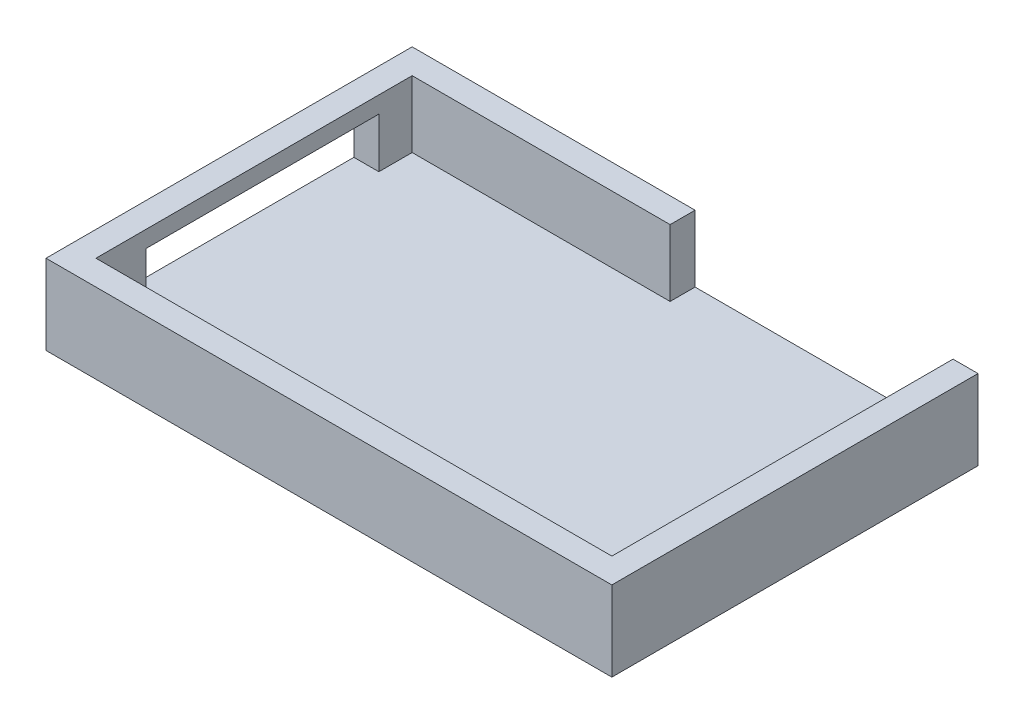
ISO-10303-21;
HEADER;
FILE_DESCRIPTION(('STEP AP214'),'2;1');
FILE_NAME('part.step','',(''),(''),'','','');
FILE_SCHEMA(('AUTOMOTIVE_DESIGN { 1 0 10303 214 1 1 1 1 }'));
ENDSEC;
DATA;
#1=APPLICATION_CONTEXT('core data for automotive mechanical design processes');
#2=APPLICATION_PROTOCOL_DEFINITION('international standard','automotive_design',2000,#1);
#3=PRODUCT_CONTEXT('',#1,'mechanical');
#4=PRODUCT('Part','Part','',(#3));
#5=PRODUCT_RELATED_PRODUCT_CATEGORY('part','',(#4));
#6=PRODUCT_DEFINITION_FORMATION('','',#4);
#7=PRODUCT_DEFINITION_CONTEXT('part definition',#1,'design');
#8=PRODUCT_DEFINITION('design','',#6,#7);
#9=PRODUCT_DEFINITION_SHAPE('','',#8);
#10=(LENGTH_UNIT() NAMED_UNIT(*) SI_UNIT(.MILLI.,.METRE.));
#11=(NAMED_UNIT(*) PLANE_ANGLE_UNIT() SI_UNIT($,.RADIAN.));
#12=(NAMED_UNIT(*) SI_UNIT($,.STERADIAN.) SOLID_ANGLE_UNIT());
#13=UNCERTAINTY_MEASURE_WITH_UNIT(LENGTH_MEASURE(1.E-05),#10,'distance_accuracy_value','');
#14=(GEOMETRIC_REPRESENTATION_CONTEXT(3) GLOBAL_UNCERTAINTY_ASSIGNED_CONTEXT((#13)) GLOBAL_UNIT_ASSIGNED_CONTEXT((#10,
#11,#12)) REPRESENTATION_CONTEXT('',''));
#15=CARTESIAN_POINT('',(0.,0.,0.));
#16=DIRECTION('',(0.,0.,1.));
#17=DIRECTION('',(1.,0.,0.));
#18=AXIS2_PLACEMENT_3D('',#15,#16,#17);
#19=CARTESIAN_POINT('',(85.,4.,55.));
#20=DIRECTION('',(-1.,0.,0.));
#21=DIRECTION('',(0.,0.,1.));
#22=AXIS2_PLACEMENT_3D('',#19,#20,#21);
#23=PLANE('',#22);
#24=DIRECTION('',(0.,0.,-1.));
#25=VECTOR('',#24,1.);
#26=CARTESIAN_POINT('',(85.,0.,55.));
#27=LINE('',#26,#25);
#28=CARTESIAN_POINT('',(85.,0.,55.));
#29=VERTEX_POINT('',#28);
#30=CARTESIAN_POINT('',(85.,0.,-55.));
#31=VERTEX_POINT('',#30);
#32=EDGE_CURVE('E192',#29,#31,#27,.T.);
#33=ORIENTED_EDGE('',*,*,#32,.T.);
#34=DIRECTION('',(0.,-1.,0.));
#35=VECTOR('',#34,1.);
#36=CARTESIAN_POINT('',(85.,4.,-55.));
#37=LINE('',#36,#35);
#38=CARTESIAN_POINT('',(85.,24.,-55.));
#39=VERTEX_POINT('',#38);
#40=EDGE_CURVE('E11',#39,#31,#37,.T.);
#41=ORIENTED_EDGE('',*,*,#40,.F.);
#42=DIRECTION('',(0.,0.,-1.));
#43=VECTOR('',#42,1.);
#44=CARTESIAN_POINT('',(85.,24.,55.));
#45=LINE('',#44,#43);
#46=CARTESIAN_POINT('',(85.,24.,55.));
#47=VERTEX_POINT('',#46);
#48=EDGE_CURVE('E186',#47,#39,#45,.T.);
#49=ORIENTED_EDGE('',*,*,#48,.F.);
#50=DIRECTION('',(0.,-1.,0.));
#51=VECTOR('',#50,1.);
#52=CARTESIAN_POINT('',(85.,4.,55.));
#53=LINE('',#52,#51);
#54=EDGE_CURVE('E201',#47,#29,#53,.T.);
#55=ORIENTED_EDGE('',*,*,#54,.T.);
#56=EDGE_LOOP('',(#33,#41,#49,#55));
#57=FACE_BOUND('',#56,.T.);
#58=ADVANCED_FACE('F36',(#57),#23,.F.);
#59=CARTESIAN_POINT('',(-85.,4.,-55.));
#60=DIRECTION('',(0.,0.,1.));
#61=DIRECTION('',(1.,0.,0.));
#62=AXIS2_PLACEMENT_3D('',#59,#60,#61);
#63=PLANE('',#62);
#64=DIRECTION('',(1.,0.,0.));
#65=VECTOR('',#64,1.);
#66=CARTESIAN_POINT('',(-85.,4.,-55.));
#67=LINE('',#66,#65);
#68=CARTESIAN_POINT('',(0.,4.,-55.));
#69=VERTEX_POINT('',#68);
#70=CARTESIAN_POINT('',(77.5,4.,-55.));
#71=VERTEX_POINT('',#70);
#72=EDGE_CURVE('E229',#69,#71,#67,.T.);
#73=ORIENTED_EDGE('',*,*,#72,.T.);
#74=DIRECTION('',(0.,1.,0.));
#75=VECTOR('',#74,1.);
#76=CARTESIAN_POINT('',(77.5,4.,-55.));
#77=LINE('',#76,#75);
#78=CARTESIAN_POINT('',(77.5,24.,-55.));
#79=VERTEX_POINT('',#78);
#80=EDGE_CURVE('E228',#71,#79,#77,.T.);
#81=ORIENTED_EDGE('',*,*,#80,.T.);
#82=DIRECTION('',(-1.,0.,0.));
#83=VECTOR('',#82,1.);
#84=CARTESIAN_POINT('',(85.,24.,-55.));
#85=LINE('',#84,#83);
#86=EDGE_CURVE('E190',#39,#79,#85,.T.);
#87=ORIENTED_EDGE('',*,*,#86,.F.);
#88=ORIENTED_EDGE('',*,*,#40,.T.);
#89=DIRECTION('',(-1.,0.,0.));
#90=VECTOR('',#89,1.);
#91=CARTESIAN_POINT('',(-85.,0.,-55.));
#92=LINE('',#91,#90);
#93=CARTESIAN_POINT('',(-85.,0.,-55.));
#94=VERTEX_POINT('',#93);
#95=EDGE_CURVE('E195',#31,#94,#92,.T.);
#96=ORIENTED_EDGE('',*,*,#95,.T.);
#97=DIRECTION('',(0.,-1.,0.));
#98=VECTOR('',#97,1.);
#99=CARTESIAN_POINT('',(-85.,4.,-55.));
#100=LINE('',#99,#98);
#101=CARTESIAN_POINT('',(-85.,24.,-55.));
#102=VERTEX_POINT('',#101);
#103=EDGE_CURVE('E43',#102,#94,#100,.T.);
#104=ORIENTED_EDGE('',*,*,#103,.F.);
#105=CARTESIAN_POINT('',(0.,24.,-55.));
#106=VERTEX_POINT('',#105);
#107=EDGE_CURVE('E189',#106,#102,#85,.T.);
#108=ORIENTED_EDGE('',*,*,#107,.F.);
#109=DIRECTION('',(0.,-1.,0.));
#110=VECTOR('',#109,1.);
#111=CARTESIAN_POINT('',(0.,4.,-55.));
#112=LINE('',#111,#110);
#113=EDGE_CURVE('E138',#106,#69,#112,.T.);
#114=ORIENTED_EDGE('',*,*,#113,.T.);
#115=EDGE_LOOP('',(#73,#81,#87,#88,#96,#104,#108,#114));
#116=FACE_BOUND('',#115,.T.);
#117=ADVANCED_FACE('F226',(#116),#63,.F.);
#118=CARTESIAN_POINT('',(-85.,4.,55.));
#119=DIRECTION('',(1.,0.,0.));
#120=DIRECTION('',(0.,0.,-1.));
#121=AXIS2_PLACEMENT_3D('',#118,#119,#120);
#122=PLANE('',#121);
#123=DIRECTION('',(0.,-1.,0.));
#124=VECTOR('',#123,1.);
#125=CARTESIAN_POINT('',(-85.,4.,32.5));
#126=LINE('',#125,#124);
#127=CARTESIAN_POINT('',(-85.,19.,32.5));
#128=VERTEX_POINT('',#127);
#129=CARTESIAN_POINT('',(-85.,4.,32.5));
#130=VERTEX_POINT('',#129);
#131=EDGE_CURVE('E257',#128,#130,#126,.T.);
#132=ORIENTED_EDGE('',*,*,#131,.T.);
#133=DIRECTION('',(0.,0.,-1.));
#134=VECTOR('',#133,1.);
#135=CARTESIAN_POINT('',(-85.,4.,55.));
#136=LINE('',#135,#134);
#137=CARTESIAN_POINT('',(-85.,4.,-37.5));
#138=VERTEX_POINT('',#137);
#139=EDGE_CURVE('E260',#130,#138,#136,.T.);
#140=ORIENTED_EDGE('',*,*,#139,.T.);
#141=DIRECTION('',(0.,1.,0.));
#142=VECTOR('',#141,1.);
#143=CARTESIAN_POINT('',(-85.,4.,-37.5));
#144=LINE('',#143,#142);
#145=CARTESIAN_POINT('',(-85.,19.,-37.5));
#146=VERTEX_POINT('',#145);
#147=EDGE_CURVE('E247',#138,#146,#144,.T.);
#148=ORIENTED_EDGE('',*,*,#147,.T.);
#149=DIRECTION('',(0.,0.,1.));
#150=VECTOR('',#149,1.);
#151=CARTESIAN_POINT('',(-85.,19.,55.));
#152=LINE('',#151,#150);
#153=EDGE_CURVE('E254',#146,#128,#152,.T.);
#154=ORIENTED_EDGE('',*,*,#153,.T.);
#155=EDGE_LOOP('',(#132,#140,#148,#154));
#156=FACE_BOUND('',#155,.T.);
#157=DIRECTION('',(0.,0.,1.));
#158=VECTOR('',#157,1.);
#159=CARTESIAN_POINT('',(-85.,0.,55.));
#160=LINE('',#159,#158);
#161=CARTESIAN_POINT('',(-85.,0.,55.));
#162=VERTEX_POINT('',#161);
#163=EDGE_CURVE('E197',#94,#162,#160,.T.);
#164=ORIENTED_EDGE('',*,*,#163,.T.);
#165=DIRECTION('',(0.,-1.,0.));
#166=VECTOR('',#165,1.);
#167=CARTESIAN_POINT('',(-85.,4.,55.));
#168=LINE('',#167,#166);
#169=CARTESIAN_POINT('',(-85.,24.,55.));
#170=VERTEX_POINT('',#169);
#171=EDGE_CURVE('E204',#170,#162,#168,.T.);
#172=ORIENTED_EDGE('',*,*,#171,.F.);
#173=DIRECTION('',(0.,0.,1.));
#174=VECTOR('',#173,1.);
#175=CARTESIAN_POINT('',(-85.,24.,55.));
#176=LINE('',#175,#174);
#177=EDGE_CURVE('E180',#102,#170,#176,.T.);
#178=ORIENTED_EDGE('',*,*,#177,.F.);
#179=ORIENTED_EDGE('',*,*,#103,.T.);
#180=EDGE_LOOP('',(#164,#172,#178,#179));
#181=FACE_BOUND('',#180,.T.);
#182=ADVANCED_FACE('F211',(#156,#181),#122,.F.);
#183=CARTESIAN_POINT('',(-85.,4.,55.));
#184=DIRECTION('',(0.,0.,-1.));
#185=DIRECTION('',(-1.,0.,0.));
#186=AXIS2_PLACEMENT_3D('',#183,#184,#185);
#187=PLANE('',#186);
#188=DIRECTION('',(1.,0.,0.));
#189=VECTOR('',#188,1.);
#190=CARTESIAN_POINT('',(-85.,0.,55.));
#191=LINE('',#190,#189);
#192=EDGE_CURVE('E199',#162,#29,#191,.T.);
#193=ORIENTED_EDGE('',*,*,#192,.T.);
#194=ORIENTED_EDGE('',*,*,#54,.F.);
#195=DIRECTION('',(1.,0.,0.));
#196=VECTOR('',#195,1.);
#197=CARTESIAN_POINT('',(85.,24.,55.));
#198=LINE('',#197,#196);
#199=EDGE_CURVE('E183',#170,#47,#198,.T.);
#200=ORIENTED_EDGE('',*,*,#199,.F.);
#201=ORIENTED_EDGE('',*,*,#171,.T.);
#202=EDGE_LOOP('',(#193,#194,#200,#201));
#203=FACE_BOUND('',#202,.T.);
#204=ADVANCED_FACE('F218',(#203),#187,.F.);
#205=CARTESIAN_POINT('',(0.,0.,0.));
#206=DIRECTION('',(0.,-1.,0.));
#207=DIRECTION('',(0.,0.,-1.));
#208=AXIS2_PLACEMENT_3D('',#205,#206,#207);
#209=PLANE('',#208);
#210=ORIENTED_EDGE('',*,*,#32,.F.);
#211=ORIENTED_EDGE('',*,*,#192,.F.);
#212=ORIENTED_EDGE('',*,*,#163,.F.);
#213=ORIENTED_EDGE('',*,*,#95,.F.);
#214=EDGE_LOOP('',(#210,#211,#212,#213));
#215=FACE_BOUND('',#214,.T.);
#216=ADVANCED_FACE('F216',(#215),#209,.T.);
#217=CARTESIAN_POINT('',(0.,24.,0.));
#218=DIRECTION('',(0.,1.,0.));
#219=DIRECTION('',(0.,0.,1.));
#220=AXIS2_PLACEMENT_3D('',#217,#218,#219);
#221=PLANE('',#220);
#222=ORIENTED_EDGE('',*,*,#86,.T.);
#223=DIRECTION('',(0.,0.,-1.));
#224=VECTOR('',#223,1.);
#225=CARTESIAN_POINT('',(77.5,24.,47.5));
#226=LINE('',#225,#224);
#227=CARTESIAN_POINT('',(77.5,24.,47.5));
#228=VERTEX_POINT('',#227);
#229=EDGE_CURVE('E158',#228,#79,#226,.T.);
#230=ORIENTED_EDGE('',*,*,#229,.F.);
#231=DIRECTION('',(1.,0.,0.));
#232=VECTOR('',#231,1.);
#233=CARTESIAN_POINT('',(77.5,24.,47.5));
#234=LINE('',#233,#232);
#235=CARTESIAN_POINT('',(-77.5,24.,47.5));
#236=VERTEX_POINT('',#235);
#237=EDGE_CURVE('E162',#236,#228,#234,.T.);
#238=ORIENTED_EDGE('',*,*,#237,.F.);
#239=DIRECTION('',(0.,0.,1.));
#240=VECTOR('',#239,1.);
#241=CARTESIAN_POINT('',(-77.5,24.,47.5));
#242=LINE('',#241,#240);
#243=CARTESIAN_POINT('',(-77.5,24.,-47.5));
#244=VERTEX_POINT('',#243);
#245=EDGE_CURVE('E156',#244,#236,#242,.T.);
#246=ORIENTED_EDGE('',*,*,#245,.F.);
#247=DIRECTION('',(-1.,0.,0.));
#248=VECTOR('',#247,1.);
#249=CARTESIAN_POINT('',(77.5,24.,-47.5));
#250=LINE('',#249,#248);
#251=CARTESIAN_POINT('',(0.,24.,-47.5));
#252=VERTEX_POINT('',#251);
#253=EDGE_CURVE('E148',#252,#244,#250,.T.);
#254=ORIENTED_EDGE('',*,*,#253,.F.);
#255=DIRECTION('',(0.,0.,1.));
#256=VECTOR('',#255,1.);
#257=CARTESIAN_POINT('',(0.,24.,-67.5));
#258=LINE('',#257,#256);
#259=EDGE_CURVE('E135',#106,#252,#258,.T.);
#260=ORIENTED_EDGE('',*,*,#259,.F.);
#261=ORIENTED_EDGE('',*,*,#107,.T.);
#262=ORIENTED_EDGE('',*,*,#177,.T.);
#263=ORIENTED_EDGE('',*,*,#199,.T.);
#264=ORIENTED_EDGE('',*,*,#48,.T.);
#265=EDGE_LOOP('',(#222,#230,#238,#246,#254,#260,#261,#262,#263,#264));
#266=FACE_BOUND('',#265,.T.);
#267=ADVANCED_FACE('F154',(#266),#221,.T.);
#268=CARTESIAN_POINT('',(-77.5,24.,47.5));
#269=DIRECTION('',(1.,0.,0.));
#270=DIRECTION('',(0.,0.,-1.));
#271=AXIS2_PLACEMENT_3D('',#268,#269,#270);
#272=PLANE('',#271);
#273=DIRECTION('',(0.,-1.,0.));
#274=VECTOR('',#273,1.);
#275=CARTESIAN_POINT('',(-77.5,4.,32.5));
#276=LINE('',#275,#274);
#277=CARTESIAN_POINT('',(-77.5,19.,32.5));
#278=VERTEX_POINT('',#277);
#279=CARTESIAN_POINT('',(-77.5,4.,32.5));
#280=VERTEX_POINT('',#279);
#281=EDGE_CURVE('E241',#278,#280,#276,.T.);
#282=ORIENTED_EDGE('',*,*,#281,.F.);
#283=DIRECTION('',(0.,0.,1.));
#284=VECTOR('',#283,1.);
#285=CARTESIAN_POINT('',(-77.5,19.,32.5));
#286=LINE('',#285,#284);
#287=CARTESIAN_POINT('',(-77.5,19.,-37.5));
#288=VERTEX_POINT('',#287);
#289=EDGE_CURVE('E234',#288,#278,#286,.T.);
#290=ORIENTED_EDGE('',*,*,#289,.F.);
#291=DIRECTION('',(0.,1.,0.));
#292=VECTOR('',#291,1.);
#293=CARTESIAN_POINT('',(-77.5,4.,-37.5));
#294=LINE('',#293,#292);
#295=CARTESIAN_POINT('',(-77.5,4.,-37.5));
#296=VERTEX_POINT('',#295);
#297=EDGE_CURVE('E232',#296,#288,#294,.T.);
#298=ORIENTED_EDGE('',*,*,#297,.F.);
#299=DIRECTION('',(0.,0.,1.));
#300=VECTOR('',#299,1.);
#301=CARTESIAN_POINT('',(-77.5,4.,47.5));
#302=LINE('',#301,#300);
#303=CARTESIAN_POINT('',(-77.5,4.,-47.5));
#304=VERTEX_POINT('',#303);
#305=EDGE_CURVE('E166',#304,#296,#302,.T.);
#306=ORIENTED_EDGE('',*,*,#305,.F.);
#307=DIRECTION('',(0.,-1.,0.));
#308=VECTOR('',#307,1.);
#309=CARTESIAN_POINT('',(-77.5,24.,-47.5));
#310=LINE('',#309,#308);
#311=EDGE_CURVE('E157',#244,#304,#310,.T.);
#312=ORIENTED_EDGE('',*,*,#311,.F.);
#313=ORIENTED_EDGE('',*,*,#245,.T.);
#314=DIRECTION('',(0.,-1.,0.));
#315=VECTOR('',#314,1.);
#316=CARTESIAN_POINT('',(-77.5,24.,47.5));
#317=LINE('',#316,#315);
#318=CARTESIAN_POINT('',(-77.5,4.,47.5));
#319=VERTEX_POINT('',#318);
#320=EDGE_CURVE('E177',#236,#319,#317,.T.);
#321=ORIENTED_EDGE('',*,*,#320,.T.);
#322=EDGE_CURVE('E170',#280,#319,#302,.T.);
#323=ORIENTED_EDGE('',*,*,#322,.F.);
#324=EDGE_LOOP('',(#282,#290,#298,#306,#312,#313,#321,#323));
#325=FACE_BOUND('',#324,.T.);
#326=ADVANCED_FACE('F274',(#325),#272,.T.);
#327=CARTESIAN_POINT('',(77.5,24.,47.5));
#328=DIRECTION('',(0.,0.,-1.));
#329=DIRECTION('',(-1.,0.,0.));
#330=AXIS2_PLACEMENT_3D('',#327,#328,#329);
#331=PLANE('',#330);
#332=DIRECTION('',(1.,0.,0.));
#333=VECTOR('',#332,1.);
#334=CARTESIAN_POINT('',(77.5,4.,47.5));
#335=LINE('',#334,#333);
#336=CARTESIAN_POINT('',(77.5,4.,47.5));
#337=VERTEX_POINT('',#336);
#338=EDGE_CURVE('E169',#319,#337,#335,.T.);
#339=ORIENTED_EDGE('',*,*,#338,.F.);
#340=ORIENTED_EDGE('',*,*,#320,.F.);
#341=ORIENTED_EDGE('',*,*,#237,.T.);
#342=DIRECTION('',(0.,-1.,0.));
#343=VECTOR('',#342,1.);
#344=CARTESIAN_POINT('',(77.5,24.,47.5));
#345=LINE('',#344,#343);
#346=EDGE_CURVE('E160',#228,#337,#345,.T.);
#347=ORIENTED_EDGE('',*,*,#346,.T.);
#348=EDGE_LOOP('',(#339,#340,#341,#347));
#349=FACE_BOUND('',#348,.T.);
#350=ADVANCED_FACE('F267',(#349),#331,.T.);
#351=CARTESIAN_POINT('',(77.5,24.,47.5));
#352=DIRECTION('',(-1.,0.,0.));
#353=DIRECTION('',(0.,0.,1.));
#354=AXIS2_PLACEMENT_3D('',#351,#352,#353);
#355=PLANE('',#354);
#356=DIRECTION('',(0.,0.,-1.));
#357=VECTOR('',#356,1.);
#358=CARTESIAN_POINT('',(77.5,4.,47.5));
#359=LINE('',#358,#357);
#360=EDGE_CURVE('E173',#337,#71,#359,.T.);
#361=ORIENTED_EDGE('',*,*,#360,.F.);
#362=ORIENTED_EDGE('',*,*,#346,.F.);
#363=ORIENTED_EDGE('',*,*,#229,.T.);
#364=ORIENTED_EDGE('',*,*,#80,.F.);
#365=EDGE_LOOP('',(#361,#362,#363,#364));
#366=FACE_BOUND('',#365,.T.);
#367=ADVANCED_FACE('F268',(#366),#355,.T.);
#368=CARTESIAN_POINT('',(77.5,24.,-47.5));
#369=DIRECTION('',(0.,0.,1.));
#370=DIRECTION('',(1.,0.,0.));
#371=AXIS2_PLACEMENT_3D('',#368,#369,#370);
#372=PLANE('',#371);
#373=DIRECTION('',(0.,-1.,0.));
#374=VECTOR('',#373,1.);
#375=CARTESIAN_POINT('',(0.,4.,-47.5));
#376=LINE('',#375,#374);
#377=CARTESIAN_POINT('',(0.,4.,-47.5));
#378=VERTEX_POINT('',#377);
#379=EDGE_CURVE('E50',#252,#378,#376,.T.);
#380=ORIENTED_EDGE('',*,*,#379,.F.);
#381=ORIENTED_EDGE('',*,*,#253,.T.);
#382=ORIENTED_EDGE('',*,*,#311,.T.);
#383=DIRECTION('',(-1.,0.,0.));
#384=VECTOR('',#383,1.);
#385=CARTESIAN_POINT('',(77.5,4.,-47.5));
#386=LINE('',#385,#384);
#387=EDGE_CURVE('E150',#378,#304,#386,.T.);
#388=ORIENTED_EDGE('',*,*,#387,.F.);
#389=EDGE_LOOP('',(#380,#381,#382,#388));
#390=FACE_BOUND('',#389,.T.);
#391=ADVANCED_FACE('F146',(#390),#372,.T.);
#392=CARTESIAN_POINT('',(0.,4.,0.));
#393=DIRECTION('',(0.,-1.,0.));
#394=DIRECTION('',(0.,0.,-1.));
#395=AXIS2_PLACEMENT_3D('',#392,#393,#394);
#396=PLANE('',#395);
#397=ORIENTED_EDGE('',*,*,#360,.T.);
#398=ORIENTED_EDGE('',*,*,#72,.F.);
#399=DIRECTION('',(0.,0.,1.));
#400=VECTOR('',#399,1.);
#401=CARTESIAN_POINT('',(0.,4.,-67.5));
#402=LINE('',#401,#400);
#403=EDGE_CURVE('E142',#69,#378,#402,.T.);
#404=ORIENTED_EDGE('',*,*,#403,.T.);
#405=ORIENTED_EDGE('',*,*,#387,.T.);
#406=ORIENTED_EDGE('',*,*,#305,.T.);
#407=DIRECTION('',(1.,0.,0.));
#408=VECTOR('',#407,1.);
#409=CARTESIAN_POINT('',(-97.5,4.,-37.5));
#410=LINE('',#409,#408);
#411=EDGE_CURVE('E243',#138,#296,#410,.T.);
#412=ORIENTED_EDGE('',*,*,#411,.F.);
#413=ORIENTED_EDGE('',*,*,#139,.F.);
#414=DIRECTION('',(1.,0.,0.));
#415=VECTOR('',#414,1.);
#416=CARTESIAN_POINT('',(-97.5,4.,32.5));
#417=LINE('',#416,#415);
#418=EDGE_CURVE('E244',#130,#280,#417,.T.);
#419=ORIENTED_EDGE('',*,*,#418,.T.);
#420=ORIENTED_EDGE('',*,*,#322,.T.);
#421=ORIENTED_EDGE('',*,*,#338,.T.);
#422=EDGE_LOOP('',(#397,#398,#404,#405,#406,#412,#413,#419,#420,#421));
#423=FACE_BOUND('',#422,.T.);
#424=ADVANCED_FACE('F270',(#423),#396,.F.);
#425=CARTESIAN_POINT('',(-97.5,4.,32.5));
#426=DIRECTION('',(0.,0.,1.));
#427=DIRECTION('',(1.,0.,0.));
#428=AXIS2_PLACEMENT_3D('',#425,#426,#427);
#429=PLANE('',#428);
#430=DIRECTION('',(1.,0.,0.));
#431=VECTOR('',#430,1.);
#432=CARTESIAN_POINT('',(-97.5,19.,32.5));
#433=LINE('',#432,#431);
#434=EDGE_CURVE('E248',#128,#278,#433,.T.);
#435=ORIENTED_EDGE('',*,*,#434,.T.);
#436=ORIENTED_EDGE('',*,*,#281,.T.);
#437=ORIENTED_EDGE('',*,*,#418,.F.);
#438=ORIENTED_EDGE('',*,*,#131,.F.);
#439=EDGE_LOOP('',(#435,#436,#437,#438));
#440=FACE_BOUND('',#439,.T.);
#441=ADVANCED_FACE('F284',(#440),#429,.F.);
#442=CARTESIAN_POINT('',(-97.5,19.,32.5));
#443=DIRECTION('',(0.,1.,0.));
#444=DIRECTION('',(0.,0.,1.));
#445=AXIS2_PLACEMENT_3D('',#442,#443,#444);
#446=PLANE('',#445);
#447=DIRECTION('',(1.,0.,0.));
#448=VECTOR('',#447,1.);
#449=CARTESIAN_POINT('',(-97.5,19.,-37.5));
#450=LINE('',#449,#448);
#451=EDGE_CURVE('E58',#146,#288,#450,.T.);
#452=ORIENTED_EDGE('',*,*,#451,.T.);
#453=ORIENTED_EDGE('',*,*,#289,.T.);
#454=ORIENTED_EDGE('',*,*,#434,.F.);
#455=ORIENTED_EDGE('',*,*,#153,.F.);
#456=EDGE_LOOP('',(#452,#453,#454,#455));
#457=FACE_BOUND('',#456,.T.);
#458=ADVANCED_FACE('F286',(#457),#446,.F.);
#459=CARTESIAN_POINT('',(-97.5,4.,-37.5));
#460=DIRECTION('',(0.,0.,-1.));
#461=DIRECTION('',(-1.,0.,0.));
#462=AXIS2_PLACEMENT_3D('',#459,#460,#461);
#463=PLANE('',#462);
#464=ORIENTED_EDGE('',*,*,#411,.T.);
#465=ORIENTED_EDGE('',*,*,#297,.T.);
#466=ORIENTED_EDGE('',*,*,#451,.F.);
#467=ORIENTED_EDGE('',*,*,#147,.F.);
#468=EDGE_LOOP('',(#464,#465,#466,#467));
#469=FACE_BOUND('',#468,.T.);
#470=ADVANCED_FACE('F287',(#469),#463,.F.);
#471=CARTESIAN_POINT('',(0.,4.,-67.5));
#472=DIRECTION('',(-1.,0.,0.));
#473=DIRECTION('',(0.,0.,1.));
#474=AXIS2_PLACEMENT_3D('',#471,#472,#473);
#475=PLANE('',#474);
#476=ORIENTED_EDGE('',*,*,#259,.T.);
#477=ORIENTED_EDGE('',*,*,#379,.T.);
#478=ORIENTED_EDGE('',*,*,#403,.F.);
#479=ORIENTED_EDGE('',*,*,#113,.F.);
#480=EDGE_LOOP('',(#476,#477,#478,#479));
#481=FACE_BOUND('',#480,.T.);
#482=ADVANCED_FACE('F136',(#481),#475,.F.);
#483=CLOSED_SHELL('',(#58,#117,#182,#204,#216,#267,#326,#350,#367,#391,#424,#441,#458,#470,#482));
#484=MANIFOLD_SOLID_BREP('B2',#483);
#485=ADVANCED_BREP_SHAPE_REPRESENTATION('',(#18,#484),#14);
#486=SHAPE_DEFINITION_REPRESENTATION(#9,#485);
ENDSEC;
END-ISO-10303-21;
